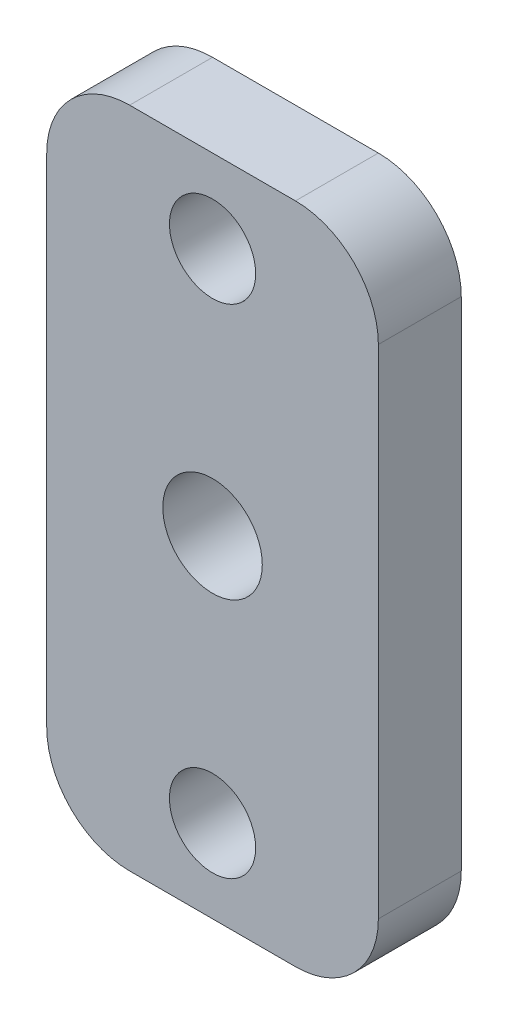
ISO-10303-21;
HEADER;
FILE_DESCRIPTION(('STEP AP214'),'2;1');
FILE_NAME('part.step','',(''),(''),'','','');
FILE_SCHEMA(('AUTOMOTIVE_DESIGN { 1 0 10303 214 1 1 1 1 }'));
ENDSEC;
DATA;
#1=APPLICATION_CONTEXT('core data for automotive mechanical design processes');
#2=APPLICATION_PROTOCOL_DEFINITION('international standard','automotive_design',2000,#1);
#3=PRODUCT_CONTEXT('',#1,'mechanical');
#4=PRODUCT('Part','Part','',(#3));
#5=PRODUCT_RELATED_PRODUCT_CATEGORY('part','',(#4));
#6=PRODUCT_DEFINITION_FORMATION('','',#4);
#7=PRODUCT_DEFINITION_CONTEXT('part definition',#1,'design');
#8=PRODUCT_DEFINITION('design','',#6,#7);
#9=PRODUCT_DEFINITION_SHAPE('','',#8);
#10=(LENGTH_UNIT() NAMED_UNIT(*) SI_UNIT(.MILLI.,.METRE.));
#11=(NAMED_UNIT(*) PLANE_ANGLE_UNIT() SI_UNIT($,.RADIAN.));
#12=(NAMED_UNIT(*) SI_UNIT($,.STERADIAN.) SOLID_ANGLE_UNIT());
#13=UNCERTAINTY_MEASURE_WITH_UNIT(LENGTH_MEASURE(1.E-05),#10,'distance_accuracy_value','');
#14=(GEOMETRIC_REPRESENTATION_CONTEXT(3) GLOBAL_UNCERTAINTY_ASSIGNED_CONTEXT((#13)) GLOBAL_UNIT_ASSIGNED_CONTEXT((#10,
#11,#12)) REPRESENTATION_CONTEXT('',''));
#15=CARTESIAN_POINT('',(0.,0.,0.));
#16=DIRECTION('',(0.,0.,1.));
#17=DIRECTION('',(1.,0.,0.));
#18=AXIS2_PLACEMENT_3D('',#15,#16,#17);
#19=CARTESIAN_POINT('',(0.,0.,2.5));
#20=DIRECTION('',(0.,0.,1.));
#21=DIRECTION('',(1.,0.,0.));
#22=AXIS2_PLACEMENT_3D('',#19,#20,#21);
#23=PLANE('',#22);
#24=CARTESIAN_POINT('',(0.,-15.,2.5));
#25=DIRECTION('',(0.,0.,-1.));
#26=DIRECTION('',(1.,0.,0.));
#27=AXIS2_PLACEMENT_3D('',#24,#25,#26);
#28=CIRCLE('',#27,2.6);
#29=CARTESIAN_POINT('',(2.6,-15.,2.5));
#30=VERTEX_POINT('',#29);
#31=EDGE_CURVE('E176',#30,#30,#28,.T.);
#32=ORIENTED_EDGE('',*,*,#31,.T.);
#33=EDGE_LOOP('',(#32));
#34=FACE_BOUND('',#33,.T.);
#35=CARTESIAN_POINT('',(0.,15.,2.5));
#36=DIRECTION('',(0.,0.,1.));
#37=DIRECTION('',(1.,0.,0.));
#38=AXIS2_PLACEMENT_3D('',#35,#36,#37);
#39=CIRCLE('',#38,2.6);
#40=CARTESIAN_POINT('',(2.6,15.,2.5));
#41=VERTEX_POINT('',#40);
#42=EDGE_CURVE('E166',#41,#41,#39,.T.);
#43=ORIENTED_EDGE('',*,*,#42,.F.);
#44=EDGE_LOOP('',(#43));
#45=FACE_BOUND('',#44,.T.);
#46=DIRECTION('',(1.,0.,0.));
#47=VECTOR('',#46,1.);
#48=CARTESIAN_POINT('',(-9.99999999999999,-20.,2.5));
#49=LINE('',#48,#47);
#50=CARTESIAN_POINT('',(-5.,-20.,2.5));
#51=VERTEX_POINT('',#50);
#52=CARTESIAN_POINT('',(5.,-20.,2.5));
#53=VERTEX_POINT('',#52);
#54=EDGE_CURVE('E140',#51,#53,#49,.T.);
#55=ORIENTED_EDGE('',*,*,#54,.T.);
#56=CARTESIAN_POINT('',(5.,-15.,2.5));
#57=DIRECTION('',(0.,0.,1.));
#58=DIRECTION('',(1.,0.,0.));
#59=AXIS2_PLACEMENT_3D('',#56,#57,#58);
#60=CIRCLE('',#59,5.);
#61=CARTESIAN_POINT('',(10.,-15.,2.5));
#62=VERTEX_POINT('',#61);
#63=EDGE_CURVE('E158',#53,#62,#60,.T.);
#64=ORIENTED_EDGE('',*,*,#63,.T.);
#65=DIRECTION('',(0.,1.,0.));
#66=VECTOR('',#65,1.);
#67=CARTESIAN_POINT('',(10.,20.,2.5));
#68=LINE('',#67,#66);
#69=CARTESIAN_POINT('',(10.,15.,2.5));
#70=VERTEX_POINT('',#69);
#71=EDGE_CURVE('E122',#62,#70,#68,.T.);
#72=ORIENTED_EDGE('',*,*,#71,.T.);
#73=CARTESIAN_POINT('',(5.,15.,2.5));
#74=DIRECTION('',(0.,0.,1.));
#75=DIRECTION('',(1.,0.,0.));
#76=AXIS2_PLACEMENT_3D('',#73,#74,#75);
#77=CIRCLE('',#76,5.);
#78=CARTESIAN_POINT('',(5.,20.,2.5));
#79=VERTEX_POINT('',#78);
#80=EDGE_CURVE('E154',#70,#79,#77,.T.);
#81=ORIENTED_EDGE('',*,*,#80,.T.);
#82=DIRECTION('',(-1.,0.,0.));
#83=VECTOR('',#82,1.);
#84=CARTESIAN_POINT('',(-10.,20.,2.5));
#85=LINE('',#84,#83);
#86=CARTESIAN_POINT('',(-5.,20.,2.5));
#87=VERTEX_POINT('',#86);
#88=EDGE_CURVE('E180',#79,#87,#85,.T.);
#89=ORIENTED_EDGE('',*,*,#88,.T.);
#90=CARTESIAN_POINT('',(-5.,15.,2.5));
#91=DIRECTION('',(0.,0.,1.));
#92=DIRECTION('',(1.,0.,0.));
#93=AXIS2_PLACEMENT_3D('',#90,#91,#92);
#94=CIRCLE('',#93,5.);
#95=CARTESIAN_POINT('',(-10.,15.,2.5));
#96=VERTEX_POINT('',#95);
#97=EDGE_CURVE('E57',#87,#96,#94,.T.);
#98=ORIENTED_EDGE('',*,*,#97,.T.);
#99=DIRECTION('',(0.,-1.,0.));
#100=VECTOR('',#99,1.);
#101=CARTESIAN_POINT('',(-10.,20.,2.5));
#102=LINE('',#101,#100);
#103=CARTESIAN_POINT('',(-9.99999999999999,-15.,2.5));
#104=VERTEX_POINT('',#103);
#105=EDGE_CURVE('E181',#96,#104,#102,.T.);
#106=ORIENTED_EDGE('',*,*,#105,.T.);
#107=CARTESIAN_POINT('',(-5.,-15.,2.5));
#108=DIRECTION('',(0.,0.,1.));
#109=DIRECTION('',(1.,0.,0.));
#110=AXIS2_PLACEMENT_3D('',#107,#108,#109);
#111=CIRCLE('',#110,5.);
#112=EDGE_CURVE('E156',#104,#51,#111,.T.);
#113=ORIENTED_EDGE('',*,*,#112,.T.);
#114=EDGE_LOOP('',(#55,#64,#72,#81,#89,#98,#106,#113));
#115=FACE_BOUND('',#114,.T.);
#116=CARTESIAN_POINT('',(0.,0.,2.5));
#117=DIRECTION('',(0.,0.,1.));
#118=DIRECTION('',(1.,0.,0.));
#119=AXIS2_PLACEMENT_3D('',#116,#117,#118);
#120=CIRCLE('',#119,3.);
#121=CARTESIAN_POINT('',(3.,0.,2.5));
#122=VERTEX_POINT('',#121);
#123=EDGE_CURVE('E131',#122,#122,#120,.T.);
#124=ORIENTED_EDGE('',*,*,#123,.F.);
#125=EDGE_LOOP('',(#124));
#126=FACE_BOUND('',#125,.T.);
#127=ADVANCED_FACE('F33',(#34,#45,#115,#126),#23,.T.);
#128=CARTESIAN_POINT('',(0.,0.,-2.5));
#129=DIRECTION('',(0.,0.,1.));
#130=DIRECTION('',(1.,0.,0.));
#131=AXIS2_PLACEMENT_3D('',#128,#129,#130);
#132=PLANE('',#131);
#133=CARTESIAN_POINT('',(0.,-15.,-2.5));
#134=DIRECTION('',(0.,0.,1.));
#135=DIRECTION('',(1.,0.,0.));
#136=AXIS2_PLACEMENT_3D('',#133,#134,#135);
#137=CIRCLE('',#136,2.6);
#138=CARTESIAN_POINT('',(2.6,-15.,-2.5));
#139=VERTEX_POINT('',#138);
#140=EDGE_CURVE('E37',#139,#139,#137,.F.);
#141=ORIENTED_EDGE('',*,*,#140,.F.);
#142=EDGE_LOOP('',(#141));
#143=FACE_BOUND('',#142,.T.);
#144=CARTESIAN_POINT('',(0.,15.,-2.5));
#145=DIRECTION('',(0.,0.,1.));
#146=DIRECTION('',(1.,0.,0.));
#147=AXIS2_PLACEMENT_3D('',#144,#145,#146);
#148=CIRCLE('',#147,2.6);
#149=CARTESIAN_POINT('',(2.6,15.,-2.5));
#150=VERTEX_POINT('',#149);
#151=EDGE_CURVE('E164',#150,#150,#148,.T.);
#152=ORIENTED_EDGE('',*,*,#151,.T.);
#153=EDGE_LOOP('',(#152));
#154=FACE_BOUND('',#153,.T.);
#155=DIRECTION('',(0.,1.,0.));
#156=VECTOR('',#155,1.);
#157=CARTESIAN_POINT('',(10.,20.,-2.5));
#158=LINE('',#157,#156);
#159=CARTESIAN_POINT('',(10.,-15.,-2.5));
#160=VERTEX_POINT('',#159);
#161=CARTESIAN_POINT('',(10.,15.,-2.5));
#162=VERTEX_POINT('',#161);
#163=EDGE_CURVE('E119',#160,#162,#158,.T.);
#164=ORIENTED_EDGE('',*,*,#163,.F.);
#165=CARTESIAN_POINT('',(5.,-15.,-2.5));
#166=DIRECTION('',(0.,0.,1.));
#167=DIRECTION('',(1.,0.,0.));
#168=AXIS2_PLACEMENT_3D('',#165,#166,#167);
#169=CIRCLE('',#168,5.);
#170=CARTESIAN_POINT('',(5.,-20.,-2.5));
#171=VERTEX_POINT('',#170);
#172=EDGE_CURVE('E102',#160,#171,#169,.F.);
#173=ORIENTED_EDGE('',*,*,#172,.T.);
#174=DIRECTION('',(1.,0.,0.));
#175=VECTOR('',#174,1.);
#176=CARTESIAN_POINT('',(-9.99999999999999,-20.,-2.5));
#177=LINE('',#176,#175);
#178=CARTESIAN_POINT('',(-5.,-20.,-2.5));
#179=VERTEX_POINT('',#178);
#180=EDGE_CURVE('E144',#179,#171,#177,.T.);
#181=ORIENTED_EDGE('',*,*,#180,.F.);
#182=CARTESIAN_POINT('',(-5.,-15.,-2.5));
#183=DIRECTION('',(0.,0.,1.));
#184=DIRECTION('',(1.,0.,0.));
#185=AXIS2_PLACEMENT_3D('',#182,#183,#184);
#186=CIRCLE('',#185,5.);
#187=CARTESIAN_POINT('',(-9.99999999999999,-15.,-2.5));
#188=VERTEX_POINT('',#187);
#189=EDGE_CURVE('E113',#179,#188,#186,.F.);
#190=ORIENTED_EDGE('',*,*,#189,.T.);
#191=DIRECTION('',(0.,-1.,0.));
#192=VECTOR('',#191,1.);
#193=CARTESIAN_POINT('',(-10.,20.,-2.5));
#194=LINE('',#193,#192);
#195=CARTESIAN_POINT('',(-10.,15.,-2.5));
#196=VERTEX_POINT('',#195);
#197=EDGE_CURVE('E134',#196,#188,#194,.T.);
#198=ORIENTED_EDGE('',*,*,#197,.F.);
#199=CARTESIAN_POINT('',(-5.,15.,-2.5));
#200=DIRECTION('',(0.,0.,1.));
#201=DIRECTION('',(1.,0.,0.));
#202=AXIS2_PLACEMENT_3D('',#199,#200,#201);
#203=CIRCLE('',#202,5.);
#204=CARTESIAN_POINT('',(-5.,20.,-2.5));
#205=VERTEX_POINT('',#204);
#206=EDGE_CURVE('E123',#196,#205,#203,.F.);
#207=ORIENTED_EDGE('',*,*,#206,.T.);
#208=DIRECTION('',(-1.,0.,0.));
#209=VECTOR('',#208,1.);
#210=CARTESIAN_POINT('',(-10.,20.,-2.5));
#211=LINE('',#210,#209);
#212=CARTESIAN_POINT('',(5.,20.,-2.5));
#213=VERTEX_POINT('',#212);
#214=EDGE_CURVE('E130',#213,#205,#211,.T.);
#215=ORIENTED_EDGE('',*,*,#214,.F.);
#216=CARTESIAN_POINT('',(5.,15.,-2.5));
#217=DIRECTION('',(0.,0.,1.));
#218=DIRECTION('',(1.,0.,0.));
#219=AXIS2_PLACEMENT_3D('',#216,#217,#218);
#220=CIRCLE('',#219,5.);
#221=EDGE_CURVE('E129',#213,#162,#220,.F.);
#222=ORIENTED_EDGE('',*,*,#221,.T.);
#223=EDGE_LOOP('',(#164,#173,#181,#190,#198,#207,#215,#222));
#224=FACE_BOUND('',#223,.T.);
#225=CARTESIAN_POINT('',(0.,0.,-2.5));
#226=DIRECTION('',(0.,0.,1.));
#227=DIRECTION('',(1.,0.,0.));
#228=AXIS2_PLACEMENT_3D('',#225,#226,#227);
#229=CIRCLE('',#228,3.);
#230=CARTESIAN_POINT('',(3.,0.,-2.5));
#231=VERTEX_POINT('',#230);
#232=EDGE_CURVE('E137',#231,#231,#229,.T.);
#233=ORIENTED_EDGE('',*,*,#232,.T.);
#234=EDGE_LOOP('',(#233));
#235=FACE_BOUND('',#234,.T.);
#236=ADVANCED_FACE('F126',(#143,#154,#224,#235),#132,.F.);
#237=CARTESIAN_POINT('',(10.,20.,2.5));
#238=DIRECTION('',(-1.,0.,0.));
#239=DIRECTION('',(0.,-1.,0.));
#240=AXIS2_PLACEMENT_3D('',#237,#238,#239);
#241=PLANE('',#240);
#242=ORIENTED_EDGE('',*,*,#71,.F.);
#243=DIRECTION('',(0.,0.,-1.));
#244=VECTOR('',#243,1.);
#245=CARTESIAN_POINT('',(10.,-15.,2.5));
#246=LINE('',#245,#244);
#247=EDGE_CURVE('E106',#62,#160,#246,.T.);
#248=ORIENTED_EDGE('',*,*,#247,.T.);
#249=ORIENTED_EDGE('',*,*,#163,.T.);
#250=DIRECTION('',(0.,0.,-1.));
#251=VECTOR('',#250,1.);
#252=CARTESIAN_POINT('',(10.,15.,2.5));
#253=LINE('',#252,#251);
#254=EDGE_CURVE('E124',#162,#70,#253,.F.);
#255=ORIENTED_EDGE('',*,*,#254,.T.);
#256=EDGE_LOOP('',(#242,#248,#249,#255));
#257=FACE_BOUND('',#256,.T.);
#258=ADVANCED_FACE('F118',(#257),#241,.F.);
#259=CARTESIAN_POINT('',(-10.,20.,2.5));
#260=DIRECTION('',(0.,-1.,0.));
#261=DIRECTION('',(0.,0.,-1.));
#262=AXIS2_PLACEMENT_3D('',#259,#260,#261);
#263=PLANE('',#262);
#264=ORIENTED_EDGE('',*,*,#88,.F.);
#265=DIRECTION('',(0.,0.,-1.));
#266=VECTOR('',#265,1.);
#267=CARTESIAN_POINT('',(5.,20.,2.5));
#268=LINE('',#267,#266);
#269=EDGE_CURVE('E11',#79,#213,#268,.T.);
#270=ORIENTED_EDGE('',*,*,#269,.T.);
#271=ORIENTED_EDGE('',*,*,#214,.T.);
#272=DIRECTION('',(0.,0.,-1.));
#273=VECTOR('',#272,1.);
#274=CARTESIAN_POINT('',(-5.,20.,2.5));
#275=LINE('',#274,#273);
#276=EDGE_CURVE('E42',#205,#87,#275,.F.);
#277=ORIENTED_EDGE('',*,*,#276,.T.);
#278=EDGE_LOOP('',(#264,#270,#271,#277));
#279=FACE_BOUND('',#278,.T.);
#280=ADVANCED_FACE('F198',(#279),#263,.F.);
#281=CARTESIAN_POINT('',(-10.,20.,2.5));
#282=DIRECTION('',(1.,0.,0.));
#283=DIRECTION('',(0.,1.,0.));
#284=AXIS2_PLACEMENT_3D('',#281,#282,#283);
#285=PLANE('',#284);
#286=ORIENTED_EDGE('',*,*,#197,.T.);
#287=DIRECTION('',(0.,0.,-1.));
#288=VECTOR('',#287,1.);
#289=CARTESIAN_POINT('',(-9.99999999999999,-15.,2.5));
#290=LINE('',#289,#288);
#291=EDGE_CURVE('E50',#188,#104,#290,.F.);
#292=ORIENTED_EDGE('',*,*,#291,.T.);
#293=ORIENTED_EDGE('',*,*,#105,.F.);
#294=DIRECTION('',(0.,0.,-1.));
#295=VECTOR('',#294,1.);
#296=CARTESIAN_POINT('',(-10.,15.,2.5));
#297=LINE('',#296,#295);
#298=EDGE_CURVE('E160',#96,#196,#297,.T.);
#299=ORIENTED_EDGE('',*,*,#298,.T.);
#300=EDGE_LOOP('',(#286,#292,#293,#299));
#301=FACE_BOUND('',#300,.T.);
#302=ADVANCED_FACE('F192',(#301),#285,.F.);
#303=CARTESIAN_POINT('',(-9.99999999999999,-20.,2.5));
#304=DIRECTION('',(0.,1.,0.));
#305=DIRECTION('',(0.,0.,1.));
#306=AXIS2_PLACEMENT_3D('',#303,#304,#305);
#307=PLANE('',#306);
#308=ORIENTED_EDGE('',*,*,#180,.T.);
#309=DIRECTION('',(0.,0.,-1.));
#310=VECTOR('',#309,1.);
#311=CARTESIAN_POINT('',(5.,-20.,2.5));
#312=LINE('',#311,#310);
#313=EDGE_CURVE('E107',#171,#53,#312,.F.);
#314=ORIENTED_EDGE('',*,*,#313,.T.);
#315=ORIENTED_EDGE('',*,*,#54,.F.);
#316=DIRECTION('',(0.,0.,-1.));
#317=VECTOR('',#316,1.);
#318=CARTESIAN_POINT('',(-5.,-20.,2.5));
#319=LINE('',#318,#317);
#320=EDGE_CURVE('E112',#51,#179,#319,.T.);
#321=ORIENTED_EDGE('',*,*,#320,.T.);
#322=EDGE_LOOP('',(#308,#314,#315,#321));
#323=FACE_BOUND('',#322,.T.);
#324=ADVANCED_FACE('F188',(#323),#307,.F.);
#325=CARTESIAN_POINT('',(0.,0.,2.5));
#326=DIRECTION('',(0.,0.,-1.));
#327=DIRECTION('',(-1.,0.,0.));
#328=AXIS2_PLACEMENT_3D('',#325,#326,#327);
#329=CYLINDRICAL_SURFACE('',#328,3.);
#330=ORIENTED_EDGE('',*,*,#123,.T.);
#331=EDGE_LOOP('',(#330));
#332=FACE_BOUND('',#331,.T.);
#333=ORIENTED_EDGE('',*,*,#232,.F.);
#334=EDGE_LOOP('',(#333));
#335=FACE_BOUND('',#334,.T.);
#336=ADVANCED_FACE('F221',(#332,#335),#329,.F.);
#337=CARTESIAN_POINT('',(5.,-15.,2.5));
#338=DIRECTION('',(0.,0.,-1.));
#339=DIRECTION('',(-1.,0.,0.));
#340=AXIS2_PLACEMENT_3D('',#337,#338,#339);
#341=CYLINDRICAL_SURFACE('',#340,5.);
#342=ORIENTED_EDGE('',*,*,#63,.F.);
#343=ORIENTED_EDGE('',*,*,#313,.F.);
#344=ORIENTED_EDGE('',*,*,#172,.F.);
#345=ORIENTED_EDGE('',*,*,#247,.F.);
#346=EDGE_LOOP('',(#342,#343,#344,#345));
#347=FACE_BOUND('',#346,.T.);
#348=ADVANCED_FACE('F105',(#347),#341,.T.);
#349=CARTESIAN_POINT('',(-5.,-15.,2.5));
#350=DIRECTION('',(0.,0.,-1.));
#351=DIRECTION('',(-1.,0.,0.));
#352=AXIS2_PLACEMENT_3D('',#349,#350,#351);
#353=CYLINDRICAL_SURFACE('',#352,5.);
#354=ORIENTED_EDGE('',*,*,#112,.F.);
#355=ORIENTED_EDGE('',*,*,#291,.F.);
#356=ORIENTED_EDGE('',*,*,#189,.F.);
#357=ORIENTED_EDGE('',*,*,#320,.F.);
#358=EDGE_LOOP('',(#354,#355,#356,#357));
#359=FACE_BOUND('',#358,.T.);
#360=ADVANCED_FACE('F190',(#359),#353,.T.);
#361=CARTESIAN_POINT('',(5.,15.,2.5));
#362=DIRECTION('',(0.,0.,-1.));
#363=DIRECTION('',(-1.,0.,0.));
#364=AXIS2_PLACEMENT_3D('',#361,#362,#363);
#365=CYLINDRICAL_SURFACE('',#364,5.);
#366=ORIENTED_EDGE('',*,*,#80,.F.);
#367=ORIENTED_EDGE('',*,*,#254,.F.);
#368=ORIENTED_EDGE('',*,*,#221,.F.);
#369=ORIENTED_EDGE('',*,*,#269,.F.);
#370=EDGE_LOOP('',(#366,#367,#368,#369));
#371=FACE_BOUND('',#370,.T.);
#372=ADVANCED_FACE('F202',(#371),#365,.T.);
#373=CARTESIAN_POINT('',(-5.,15.,2.5));
#374=DIRECTION('',(0.,0.,-1.));
#375=DIRECTION('',(-1.,0.,0.));
#376=AXIS2_PLACEMENT_3D('',#373,#374,#375);
#377=CYLINDRICAL_SURFACE('',#376,5.);
#378=ORIENTED_EDGE('',*,*,#97,.F.);
#379=ORIENTED_EDGE('',*,*,#276,.F.);
#380=ORIENTED_EDGE('',*,*,#206,.F.);
#381=ORIENTED_EDGE('',*,*,#298,.F.);
#382=EDGE_LOOP('',(#378,#379,#380,#381));
#383=FACE_BOUND('',#382,.T.);
#384=ADVANCED_FACE('F35',(#383),#377,.T.);
#385=CARTESIAN_POINT('',(0.,15.,-3.5));
#386=DIRECTION('',(0.,0.,1.));
#387=DIRECTION('',(1.,0.,0.));
#388=AXIS2_PLACEMENT_3D('',#385,#386,#387);
#389=CYLINDRICAL_SURFACE('',#388,2.6);
#390=ORIENTED_EDGE('',*,*,#42,.T.);
#391=EDGE_LOOP('',(#390));
#392=FACE_BOUND('',#391,.T.);
#393=ORIENTED_EDGE('',*,*,#151,.F.);
#394=EDGE_LOOP('',(#393));
#395=FACE_BOUND('',#394,.T.);
#396=ADVANCED_FACE('F208',(#392,#395),#389,.F.);
#397=CARTESIAN_POINT('',(0.,-15.,-3.5));
#398=DIRECTION('',(0.,0.,1.));
#399=DIRECTION('',(1.,0.,0.));
#400=AXIS2_PLACEMENT_3D('',#397,#398,#399);
#401=CYLINDRICAL_SURFACE('',#400,2.6);
#402=ORIENTED_EDGE('',*,*,#31,.F.);
#403=EDGE_LOOP('',(#402));
#404=FACE_BOUND('',#403,.T.);
#405=ORIENTED_EDGE('',*,*,#140,.T.);
#406=EDGE_LOOP('',(#405));
#407=FACE_BOUND('',#406,.T.);
#408=ADVANCED_FACE('F270',(#404,#407),#401,.F.);
#409=CLOSED_SHELL('',(#127,#236,#258,#280,#302,#324,#336,#348,#360,#372,#384,#396,#408));
#410=MANIFOLD_SOLID_BREP('B2',#409);
#411=ADVANCED_BREP_SHAPE_REPRESENTATION('',(#18,#410),#14);
#412=SHAPE_DEFINITION_REPRESENTATION(#9,#411);
ENDSEC;
END-ISO-10303-21;
